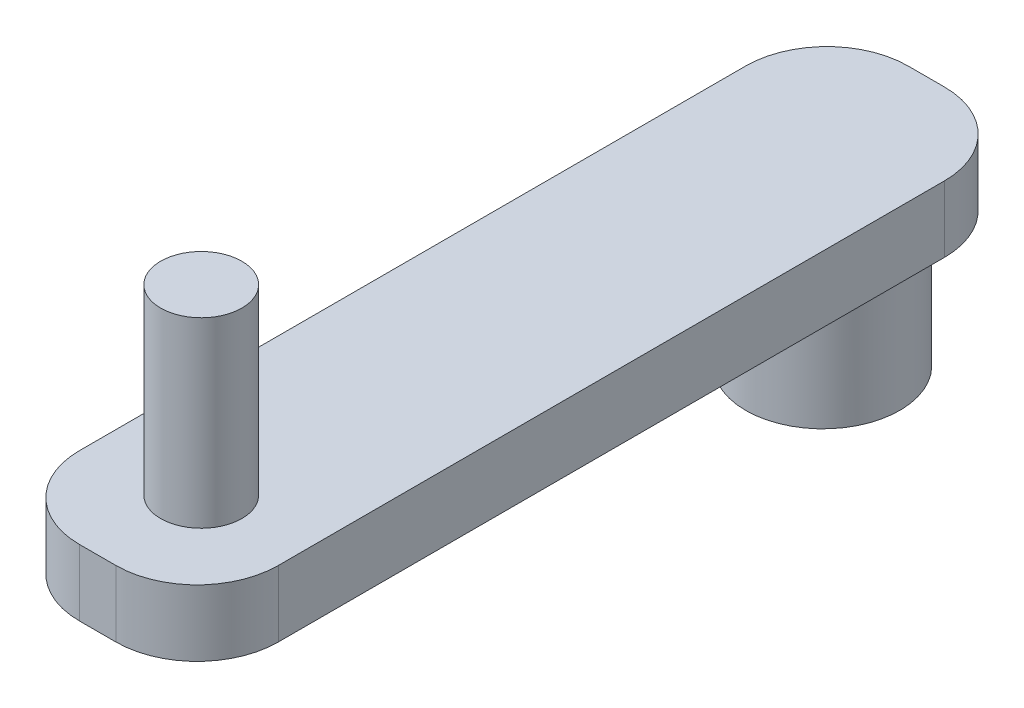
ISO-10303-21;
HEADER;
FILE_DESCRIPTION(('STEP AP214'),'2;1');
FILE_NAME('part.step','',(''),(''),'','','');
FILE_SCHEMA(('AUTOMOTIVE_DESIGN { 1 0 10303 214 1 1 1 1 }'));
ENDSEC;
DATA;
#1=APPLICATION_CONTEXT('core data for automotive mechanical design processes');
#2=APPLICATION_PROTOCOL_DEFINITION('international standard','automotive_design',2000,#1);
#3=PRODUCT_CONTEXT('',#1,'mechanical');
#4=PRODUCT('Part','Part','',(#3));
#5=PRODUCT_RELATED_PRODUCT_CATEGORY('part','',(#4));
#6=PRODUCT_DEFINITION_FORMATION('','',#4);
#7=PRODUCT_DEFINITION_CONTEXT('part definition',#1,'design');
#8=PRODUCT_DEFINITION('design','',#6,#7);
#9=PRODUCT_DEFINITION_SHAPE('','',#8);
#10=(LENGTH_UNIT() NAMED_UNIT(*) SI_UNIT(.MILLI.,.METRE.));
#11=(NAMED_UNIT(*) PLANE_ANGLE_UNIT() SI_UNIT($,.RADIAN.));
#12=(NAMED_UNIT(*) SI_UNIT($,.STERADIAN.) SOLID_ANGLE_UNIT());
#13=UNCERTAINTY_MEASURE_WITH_UNIT(LENGTH_MEASURE(1.E-05),#10,'distance_accuracy_value','');
#14=(GEOMETRIC_REPRESENTATION_CONTEXT(3) GLOBAL_UNCERTAINTY_ASSIGNED_CONTEXT((#13)) GLOBAL_UNIT_ASSIGNED_CONTEXT((#10,
#11,#12)) REPRESENTATION_CONTEXT('',''));
#15=CARTESIAN_POINT('',(0.,0.,0.));
#16=DIRECTION('',(0.,0.,1.));
#17=DIRECTION('',(1.,0.,0.));
#18=AXIS2_PLACEMENT_3D('',#15,#16,#17);
#19=CARTESIAN_POINT('',(-1.1,4.,20.1));
#20=DIRECTION('',(0.,-1.,0.));
#21=DIRECTION('',(0.,0.,-1.));
#22=AXIS2_PLACEMENT_3D('',#19,#20,#21);
#23=CYLINDRICAL_SURFACE('',#22,4.9);
#24=CARTESIAN_POINT('',(-1.1,0.,20.1));
#25=DIRECTION('',(0.,-1.,0.));
#26=DIRECTION('',(0.,0.,-1.));
#27=AXIS2_PLACEMENT_3D('',#24,#25,#26);
#28=CIRCLE('',#27,4.9);
#29=CARTESIAN_POINT('',(-1.1,0.,25.));
#30=VERTEX_POINT('',#29);
#31=CARTESIAN_POINT('',(-6.,0.,20.1));
#32=VERTEX_POINT('',#31);
#33=EDGE_CURVE('E138',#30,#32,#28,.T.);
#34=ORIENTED_EDGE('',*,*,#33,.F.);
#35=DIRECTION('',(0.,-1.,0.));
#36=VECTOR('',#35,1.);
#37=CARTESIAN_POINT('',(-1.1,4.,25.));
#38=LINE('',#37,#36);
#39=CARTESIAN_POINT('',(-1.1,4.,25.));
#40=VERTEX_POINT('',#39);
#41=EDGE_CURVE('E47',#40,#30,#38,.T.);
#42=ORIENTED_EDGE('',*,*,#41,.F.);
#43=CARTESIAN_POINT('',(-1.1,4.,20.1));
#44=DIRECTION('',(0.,-1.,0.));
#45=DIRECTION('',(0.,0.,-1.));
#46=AXIS2_PLACEMENT_3D('',#43,#44,#45);
#47=CIRCLE('',#46,4.9);
#48=CARTESIAN_POINT('',(-6.,4.,20.1));
#49=VERTEX_POINT('',#48);
#50=EDGE_CURVE('E158',#40,#49,#47,.T.);
#51=ORIENTED_EDGE('',*,*,#50,.T.);
#52=DIRECTION('',(0.,-1.,0.));
#53=VECTOR('',#52,1.);
#54=CARTESIAN_POINT('',(-6.,4.,20.1));
#55=LINE('',#54,#53);
#56=EDGE_CURVE('E92',#49,#32,#55,.T.);
#57=ORIENTED_EDGE('',*,*,#56,.T.);
#58=EDGE_LOOP('',(#34,#42,#51,#57));
#59=FACE_BOUND('',#58,.T.);
#60=ADVANCED_FACE('F39',(#59),#23,.T.);
#61=CARTESIAN_POINT('',(-1.1,4.,25.));
#62=DIRECTION('',(0.,0.,-1.));
#63=DIRECTION('',(-1.,0.,0.));
#64=AXIS2_PLACEMENT_3D('',#61,#62,#63);
#65=PLANE('',#64);
#66=DIRECTION('',(1.,0.,0.));
#67=VECTOR('',#66,1.);
#68=CARTESIAN_POINT('',(-1.1,0.,25.));
#69=LINE('',#68,#67);
#70=CARTESIAN_POINT('',(1.1,0.,25.));
#71=VERTEX_POINT('',#70);
#72=EDGE_CURVE('E83',#30,#71,#69,.T.);
#73=ORIENTED_EDGE('',*,*,#72,.T.);
#74=DIRECTION('',(0.,-1.,0.));
#75=VECTOR('',#74,1.);
#76=CARTESIAN_POINT('',(1.1,4.,25.));
#77=LINE('',#76,#75);
#78=CARTESIAN_POINT('',(1.1,4.,25.));
#79=VERTEX_POINT('',#78);
#80=EDGE_CURVE('E125',#79,#71,#77,.T.);
#81=ORIENTED_EDGE('',*,*,#80,.F.);
#82=DIRECTION('',(1.,0.,0.));
#83=VECTOR('',#82,1.);
#84=CARTESIAN_POINT('',(-1.1,4.,25.));
#85=LINE('',#84,#83);
#86=EDGE_CURVE('E115',#40,#79,#85,.T.);
#87=ORIENTED_EDGE('',*,*,#86,.F.);
#88=ORIENTED_EDGE('',*,*,#41,.T.);
#89=EDGE_LOOP('',(#73,#81,#87,#88));
#90=FACE_BOUND('',#89,.T.);
#91=ADVANCED_FACE('F210',(#90),#65,.F.);
#92=CARTESIAN_POINT('',(1.1,4.,20.1));
#93=DIRECTION('',(0.,-1.,0.));
#94=DIRECTION('',(0.,0.,-1.));
#95=AXIS2_PLACEMENT_3D('',#92,#93,#94);
#96=CYLINDRICAL_SURFACE('',#95,4.9);
#97=CARTESIAN_POINT('',(1.1,0.,20.1));
#98=DIRECTION('',(0.,1.,0.));
#99=DIRECTION('',(0.,0.,1.));
#100=AXIS2_PLACEMENT_3D('',#97,#98,#99);
#101=CIRCLE('',#100,4.9);
#102=CARTESIAN_POINT('',(6.,0.,20.1));
#103=VERTEX_POINT('',#102);
#104=EDGE_CURVE('E122',#71,#103,#101,.T.);
#105=ORIENTED_EDGE('',*,*,#104,.T.);
#106=DIRECTION('',(0.,-1.,0.));
#107=VECTOR('',#106,1.);
#108=CARTESIAN_POINT('',(6.,4.,20.1));
#109=LINE('',#108,#107);
#110=CARTESIAN_POINT('',(6.,4.,20.1));
#111=VERTEX_POINT('',#110);
#112=EDGE_CURVE('E119',#111,#103,#109,.T.);
#113=ORIENTED_EDGE('',*,*,#112,.F.);
#114=CARTESIAN_POINT('',(1.1,4.,20.1));
#115=DIRECTION('',(0.,1.,0.));
#116=DIRECTION('',(0.,0.,1.));
#117=AXIS2_PLACEMENT_3D('',#114,#115,#116);
#118=CIRCLE('',#117,4.9);
#119=EDGE_CURVE('E108',#79,#111,#118,.T.);
#120=ORIENTED_EDGE('',*,*,#119,.F.);
#121=ORIENTED_EDGE('',*,*,#80,.T.);
#122=EDGE_LOOP('',(#105,#113,#120,#121));
#123=FACE_BOUND('',#122,.T.);
#124=ADVANCED_FACE('F120',(#123),#96,.T.);
#125=CARTESIAN_POINT('',(6.,4.,20.1));
#126=DIRECTION('',(-1.,0.,0.));
#127=DIRECTION('',(0.,0.,1.));
#128=AXIS2_PLACEMENT_3D('',#125,#126,#127);
#129=PLANE('',#128);
#130=DIRECTION('',(0.,0.,-1.));
#131=VECTOR('',#130,1.);
#132=CARTESIAN_POINT('',(6.,0.,20.1));
#133=LINE('',#132,#131);
#134=CARTESIAN_POINT('',(6.,0.,-20.1));
#135=VERTEX_POINT('',#134);
#136=EDGE_CURVE('E154',#103,#135,#133,.T.);
#137=ORIENTED_EDGE('',*,*,#136,.T.);
#138=DIRECTION('',(0.,-1.,0.));
#139=VECTOR('',#138,1.);
#140=CARTESIAN_POINT('',(6.,4.,-20.1));
#141=LINE('',#140,#139);
#142=CARTESIAN_POINT('',(6.,4.,-20.1));
#143=VERTEX_POINT('',#142);
#144=EDGE_CURVE('E126',#143,#135,#141,.T.);
#145=ORIENTED_EDGE('',*,*,#144,.F.);
#146=DIRECTION('',(0.,0.,-1.));
#147=VECTOR('',#146,1.);
#148=CARTESIAN_POINT('',(6.,4.,20.1));
#149=LINE('',#148,#147);
#150=EDGE_CURVE('E113',#111,#143,#149,.T.);
#151=ORIENTED_EDGE('',*,*,#150,.F.);
#152=ORIENTED_EDGE('',*,*,#112,.T.);
#153=EDGE_LOOP('',(#137,#145,#151,#152));
#154=FACE_BOUND('',#153,.T.);
#155=ADVANCED_FACE('F128',(#154),#129,.F.);
#156=CARTESIAN_POINT('',(1.1,4.,-20.1));
#157=DIRECTION('',(0.,-1.,0.));
#158=DIRECTION('',(0.,0.,-1.));
#159=AXIS2_PLACEMENT_3D('',#156,#157,#158);
#160=CYLINDRICAL_SURFACE('',#159,4.9);
#161=CARTESIAN_POINT('',(1.1,0.,-20.1));
#162=DIRECTION('',(0.,1.,0.));
#163=DIRECTION('',(0.,0.,1.));
#164=AXIS2_PLACEMENT_3D('',#161,#162,#163);
#165=CIRCLE('',#164,4.9);
#166=CARTESIAN_POINT('',(1.1,0.,-25.));
#167=VERTEX_POINT('',#166);
#168=EDGE_CURVE('E151',#135,#167,#165,.T.);
#169=ORIENTED_EDGE('',*,*,#168,.T.);
#170=DIRECTION('',(0.,-1.,0.));
#171=VECTOR('',#170,1.);
#172=CARTESIAN_POINT('',(1.1,4.,-25.));
#173=LINE('',#172,#171);
#174=CARTESIAN_POINT('',(1.1,4.,-25.));
#175=VERTEX_POINT('',#174);
#176=EDGE_CURVE('E162',#175,#167,#173,.T.);
#177=ORIENTED_EDGE('',*,*,#176,.F.);
#178=CARTESIAN_POINT('',(1.1,4.,-20.1));
#179=DIRECTION('',(0.,1.,0.));
#180=DIRECTION('',(0.,0.,1.));
#181=AXIS2_PLACEMENT_3D('',#178,#179,#180);
#182=CIRCLE('',#181,4.9);
#183=EDGE_CURVE('E131',#143,#175,#182,.T.);
#184=ORIENTED_EDGE('',*,*,#183,.F.);
#185=ORIENTED_EDGE('',*,*,#144,.T.);
#186=EDGE_LOOP('',(#169,#177,#184,#185));
#187=FACE_BOUND('',#186,.T.);
#188=ADVANCED_FACE('F173',(#187),#160,.T.);
#189=CARTESIAN_POINT('',(-1.1,4.,-25.));
#190=DIRECTION('',(0.,0.,-1.));
#191=DIRECTION('',(-1.,0.,0.));
#192=AXIS2_PLACEMENT_3D('',#189,#190,#191);
#193=PLANE('',#192);
#194=DIRECTION('',(1.,0.,0.));
#195=VECTOR('',#194,1.);
#196=CARTESIAN_POINT('',(-1.1,0.,-25.));
#197=LINE('',#196,#195);
#198=CARTESIAN_POINT('',(-1.1,0.,-25.));
#199=VERTEX_POINT('',#198);
#200=EDGE_CURVE('E148',#199,#167,#197,.T.);
#201=ORIENTED_EDGE('',*,*,#200,.F.);
#202=DIRECTION('',(0.,-1.,0.));
#203=VECTOR('',#202,1.);
#204=CARTESIAN_POINT('',(-1.1,4.,-25.));
#205=LINE('',#204,#203);
#206=CARTESIAN_POINT('',(-1.1,4.,-25.));
#207=VERTEX_POINT('',#206);
#208=EDGE_CURVE('E164',#207,#199,#205,.T.);
#209=ORIENTED_EDGE('',*,*,#208,.F.);
#210=DIRECTION('',(1.,0.,0.));
#211=VECTOR('',#210,1.);
#212=CARTESIAN_POINT('',(-1.1,4.,-25.));
#213=LINE('',#212,#211);
#214=EDGE_CURVE('E133',#207,#175,#213,.T.);
#215=ORIENTED_EDGE('',*,*,#214,.T.);
#216=ORIENTED_EDGE('',*,*,#176,.T.);
#217=EDGE_LOOP('',(#201,#209,#215,#216));
#218=FACE_BOUND('',#217,.T.);
#219=ADVANCED_FACE('F226',(#218),#193,.T.);
#220=CARTESIAN_POINT('',(-1.1,4.,-20.1));
#221=DIRECTION('',(0.,-1.,0.));
#222=DIRECTION('',(0.,0.,-1.));
#223=AXIS2_PLACEMENT_3D('',#220,#221,#222);
#224=CYLINDRICAL_SURFACE('',#223,4.9);
#225=CARTESIAN_POINT('',(-1.1,0.,-20.1));
#226=DIRECTION('',(0.,-1.,0.));
#227=DIRECTION('',(0.,0.,-1.));
#228=AXIS2_PLACEMENT_3D('',#225,#226,#227);
#229=CIRCLE('',#228,4.9);
#230=CARTESIAN_POINT('',(-6.,0.,-20.1));
#231=VERTEX_POINT('',#230);
#232=EDGE_CURVE('E145',#231,#199,#229,.T.);
#233=ORIENTED_EDGE('',*,*,#232,.F.);
#234=DIRECTION('',(0.,-1.,0.));
#235=VECTOR('',#234,1.);
#236=CARTESIAN_POINT('',(-6.,4.,-20.1));
#237=LINE('',#236,#235);
#238=CARTESIAN_POINT('',(-6.,4.,-20.1));
#239=VERTEX_POINT('',#238);
#240=EDGE_CURVE('E166',#239,#231,#237,.T.);
#241=ORIENTED_EDGE('',*,*,#240,.F.);
#242=CARTESIAN_POINT('',(-1.1,4.,-20.1));
#243=DIRECTION('',(0.,-1.,0.));
#244=DIRECTION('',(0.,0.,-1.));
#245=AXIS2_PLACEMENT_3D('',#242,#243,#244);
#246=CIRCLE('',#245,4.9);
#247=EDGE_CURVE('E179',#239,#207,#246,.T.);
#248=ORIENTED_EDGE('',*,*,#247,.T.);
#249=ORIENTED_EDGE('',*,*,#208,.T.);
#250=EDGE_LOOP('',(#233,#241,#248,#249));
#251=FACE_BOUND('',#250,.T.);
#252=ADVANCED_FACE('F182',(#251),#224,.T.);
#253=CARTESIAN_POINT('',(-6.,4.,20.1));
#254=DIRECTION('',(-1.,0.,0.));
#255=DIRECTION('',(0.,0.,1.));
#256=AXIS2_PLACEMENT_3D('',#253,#254,#255);
#257=PLANE('',#256);
#258=DIRECTION('',(0.,0.,-1.));
#259=VECTOR('',#258,1.);
#260=CARTESIAN_POINT('',(-6.,0.,20.1));
#261=LINE('',#260,#259);
#262=EDGE_CURVE('E141',#32,#231,#261,.T.);
#263=ORIENTED_EDGE('',*,*,#262,.F.);
#264=ORIENTED_EDGE('',*,*,#56,.F.);
#265=DIRECTION('',(0.,0.,-1.));
#266=VECTOR('',#265,1.);
#267=CARTESIAN_POINT('',(-6.,4.,20.1));
#268=LINE('',#267,#266);
#269=EDGE_CURVE('E184',#49,#239,#268,.T.);
#270=ORIENTED_EDGE('',*,*,#269,.T.);
#271=ORIENTED_EDGE('',*,*,#240,.T.);
#272=EDGE_LOOP('',(#263,#264,#270,#271));
#273=FACE_BOUND('',#272,.T.);
#274=ADVANCED_FACE('F167',(#273),#257,.T.);
#275=CARTESIAN_POINT('',(-1.1,4.,20.1));
#276=DIRECTION('',(0.,-1.,0.));
#277=DIRECTION('',(0.,0.,-1.));
#278=AXIS2_PLACEMENT_3D('',#275,#276,#277);
#279=PLANE('',#278);
#280=CARTESIAN_POINT('',(0.,4.,18.75));
#281=DIRECTION('',(0.,-1.,0.));
#282=DIRECTION('',(0.,0.,-1.));
#283=AXIS2_PLACEMENT_3D('',#280,#281,#282);
#284=CIRCLE('',#283,2.45);
#285=CARTESIAN_POINT('',(0.,4.,16.3));
#286=VERTEX_POINT('',#285);
#287=EDGE_CURVE('E191',#286,#286,#284,.T.);
#288=ORIENTED_EDGE('',*,*,#287,.T.);
#289=EDGE_LOOP('',(#288));
#290=FACE_BOUND('',#289,.T.);
#291=ORIENTED_EDGE('',*,*,#50,.F.);
#292=ORIENTED_EDGE('',*,*,#86,.T.);
#293=ORIENTED_EDGE('',*,*,#119,.T.);
#294=ORIENTED_EDGE('',*,*,#150,.T.);
#295=ORIENTED_EDGE('',*,*,#183,.T.);
#296=ORIENTED_EDGE('',*,*,#214,.F.);
#297=ORIENTED_EDGE('',*,*,#247,.F.);
#298=ORIENTED_EDGE('',*,*,#269,.F.);
#299=EDGE_LOOP('',(#291,#292,#293,#294,#295,#296,#297,#298));
#300=FACE_BOUND('',#299,.T.);
#301=ADVANCED_FACE('F111',(#290,#300),#279,.F.);
#302=CARTESIAN_POINT('',(-1.1,0.,20.1));
#303=DIRECTION('',(0.,-1.,0.));
#304=DIRECTION('',(0.,0.,-1.));
#305=AXIS2_PLACEMENT_3D('',#302,#303,#304);
#306=PLANE('',#305);
#307=CARTESIAN_POINT('',(0.,0.,-18.75));
#308=DIRECTION('',(0.,-1.,0.));
#309=DIRECTION('',(0.,0.,-1.));
#310=AXIS2_PLACEMENT_3D('',#307,#308,#309);
#311=CIRCLE('',#310,4.65);
#312=CARTESIAN_POINT('',(0.,0.,-23.4));
#313=VERTEX_POINT('',#312);
#314=EDGE_CURVE('E11',#313,#313,#311,.T.);
#315=ORIENTED_EDGE('',*,*,#314,.F.);
#316=EDGE_LOOP('',(#315));
#317=FACE_BOUND('',#316,.T.);
#318=ORIENTED_EDGE('',*,*,#33,.T.);
#319=ORIENTED_EDGE('',*,*,#262,.T.);
#320=ORIENTED_EDGE('',*,*,#232,.T.);
#321=ORIENTED_EDGE('',*,*,#200,.T.);
#322=ORIENTED_EDGE('',*,*,#168,.F.);
#323=ORIENTED_EDGE('',*,*,#136,.F.);
#324=ORIENTED_EDGE('',*,*,#104,.F.);
#325=ORIENTED_EDGE('',*,*,#72,.F.);
#326=EDGE_LOOP('',(#318,#319,#320,#321,#322,#323,#324,#325));
#327=FACE_BOUND('',#326,.T.);
#328=ADVANCED_FACE('F170',(#317,#327),#306,.T.);
#329=CARTESIAN_POINT('',(0.,-8.,-18.75));
#330=DIRECTION('',(0.,1.,0.));
#331=DIRECTION('',(0.,0.,1.));
#332=AXIS2_PLACEMENT_3D('',#329,#330,#331);
#333=CYLINDRICAL_SURFACE('',#332,4.65);
#334=CARTESIAN_POINT('',(0.,-8.,-18.75));
#335=DIRECTION('',(0.,1.,0.));
#336=DIRECTION('',(0.,0.,1.));
#337=AXIS2_PLACEMENT_3D('',#334,#335,#336);
#338=CIRCLE('',#337,4.65);
#339=CARTESIAN_POINT('',(0.,-8.,-14.1));
#340=VERTEX_POINT('',#339);
#341=EDGE_CURVE('E142',#340,#340,#338,.T.);
#342=ORIENTED_EDGE('',*,*,#341,.T.);
#343=EDGE_LOOP('',(#342));
#344=FACE_BOUND('',#343,.T.);
#345=ORIENTED_EDGE('',*,*,#314,.T.);
#346=EDGE_LOOP('',(#345));
#347=FACE_BOUND('',#346,.T.);
#348=ADVANCED_FACE('F238',(#344,#347),#333,.T.);
#349=CARTESIAN_POINT('',(0.,-8.,0.));
#350=DIRECTION('',(0.,1.,0.));
#351=DIRECTION('',(0.,0.,1.));
#352=AXIS2_PLACEMENT_3D('',#349,#350,#351);
#353=PLANE('',#352);
#354=ORIENTED_EDGE('',*,*,#341,.F.);
#355=EDGE_LOOP('',(#354));
#356=FACE_BOUND('',#355,.T.);
#357=ADVANCED_FACE('F207',(#356),#353,.F.);
#358=CARTESIAN_POINT('',(0.,15.,18.75));
#359=DIRECTION('',(0.,-1.,0.));
#360=DIRECTION('',(0.,0.,-1.));
#361=AXIS2_PLACEMENT_3D('',#358,#359,#360);
#362=CYLINDRICAL_SURFACE('',#361,2.45);
#363=CARTESIAN_POINT('',(0.,15.,18.75));
#364=DIRECTION('',(0.,-1.,0.));
#365=DIRECTION('',(0.,0.,-1.));
#366=AXIS2_PLACEMENT_3D('',#363,#364,#365);
#367=CIRCLE('',#366,2.45);
#368=CARTESIAN_POINT('',(0.,15.,16.3));
#369=VERTEX_POINT('',#368);
#370=EDGE_CURVE('E194',#369,#369,#367,.T.);
#371=ORIENTED_EDGE('',*,*,#370,.T.);
#372=EDGE_LOOP('',(#371));
#373=FACE_BOUND('',#372,.T.);
#374=ORIENTED_EDGE('',*,*,#287,.F.);
#375=EDGE_LOOP('',(#374));
#376=FACE_BOUND('',#375,.T.);
#377=ADVANCED_FACE('F198',(#373,#376),#362,.T.);
#378=CARTESIAN_POINT('',(0.,15.,18.75));
#379=DIRECTION('',(0.,-1.,0.));
#380=DIRECTION('',(0.,0.,-1.));
#381=AXIS2_PLACEMENT_3D('',#378,#379,#380);
#382=PLANE('',#381);
#383=ORIENTED_EDGE('',*,*,#370,.F.);
#384=EDGE_LOOP('',(#383));
#385=FACE_BOUND('',#384,.T.);
#386=ADVANCED_FACE('F201',(#385),#382,.F.);
#387=CLOSED_SHELL('',(#60,#91,#124,#155,#188,#219,#252,#274,#301,#328,#348,#357,#377,#386));
#388=MANIFOLD_SOLID_BREP('B2',#387);
#389=ADVANCED_BREP_SHAPE_REPRESENTATION('',(#18,#388),#14);
#390=SHAPE_DEFINITION_REPRESENTATION(#9,#389);
ENDSEC;
END-ISO-10303-21;
